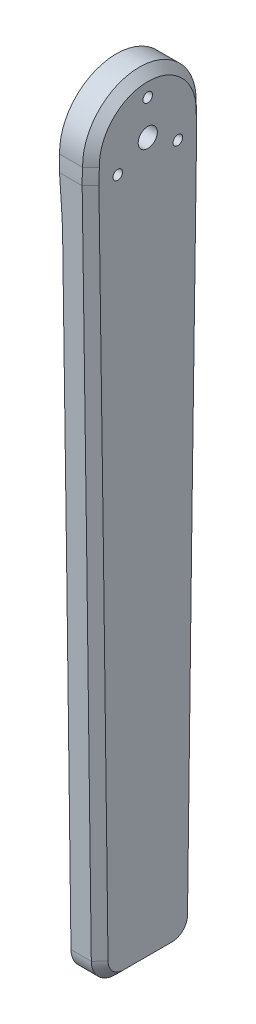
ISO-10303-21;
HEADER;
FILE_DESCRIPTION(('STEP AP214'),'2;1');
FILE_NAME('part.step','',(''),(''),'','','');
FILE_SCHEMA(('AUTOMOTIVE_DESIGN { 1 0 10303 214 1 1 1 1 }'));
ENDSEC;
DATA;
#1=APPLICATION_CONTEXT('core data for automotive mechanical design processes');
#2=APPLICATION_PROTOCOL_DEFINITION('international standard','automotive_design',2000,#1);
#3=PRODUCT_CONTEXT('',#1,'mechanical');
#4=PRODUCT('Part','Part','',(#3));
#5=PRODUCT_RELATED_PRODUCT_CATEGORY('part','',(#4));
#6=PRODUCT_DEFINITION_FORMATION('','',#4);
#7=PRODUCT_DEFINITION_CONTEXT('part definition',#1,'design');
#8=PRODUCT_DEFINITION('design','',#6,#7);
#9=PRODUCT_DEFINITION_SHAPE('','',#8);
#10=(LENGTH_UNIT() NAMED_UNIT(*) SI_UNIT(.MILLI.,.METRE.));
#11=(NAMED_UNIT(*) PLANE_ANGLE_UNIT() SI_UNIT($,.RADIAN.));
#12=(NAMED_UNIT(*) SI_UNIT($,.STERADIAN.) SOLID_ANGLE_UNIT());
#13=UNCERTAINTY_MEASURE_WITH_UNIT(LENGTH_MEASURE(1.E-05),#10,'distance_accuracy_value','');
#14=(GEOMETRIC_REPRESENTATION_CONTEXT(3) GLOBAL_UNCERTAINTY_ASSIGNED_CONTEXT((#13)) GLOBAL_UNIT_ASSIGNED_CONTEXT((#10,
#11,#12)) REPRESENTATION_CONTEXT('',''));
#15=CARTESIAN_POINT('',(0.,0.,0.));
#16=DIRECTION('',(0.,0.,1.));
#17=DIRECTION('',(1.,0.,0.));
#18=AXIS2_PLACEMENT_3D('',#15,#16,#17);
#19=CARTESIAN_POINT('',(35.5000099999999,-249.999999999978,49.9963237684379));
#20=DIRECTION('',(-1.,0.,1.14236595469087E-12));
#21=DIRECTION('',(1.14236595469087E-12,0.,1.));
#22=AXIS2_PLACEMENT_3D('',#19,#20,#21);
#23=CYLINDRICAL_SURFACE('',#22,23.75);
#24=DIRECTION('',(-1.,0.,1.14236595469087E-12));
#25=VECTOR('',#24,1.);
#26=CARTESIAN_POINT('',(35.500010000027,-250.777840414539,73.7335827569874));
#27=LINE('',#26,#25);
#28=CARTESIAN_POINT('',(32.0000100000269,-250.777840414539,73.7335827569914));
#29=VERTEX_POINT('',#28);
#30=CARTESIAN_POINT('',(22.3608290332512,-250.777840414539,73.7335827570024));
#31=VERTEX_POINT('',#30);
#32=EDGE_CURVE('E223',#29,#31,#27,.T.);
#33=ORIENTED_EDGE('',*,*,#32,.F.);
#34=CARTESIAN_POINT('',(32.0000099999998,-249.999999999978,49.9963237684419));
#35=DIRECTION('',(1.,0.,-1.14194368247155E-12));
#36=DIRECTION('',(-1.14194368247155E-12,0.,-1.));
#37=AXIS2_PLACEMENT_3D('',#34,#35,#36);
#38=CIRCLE('',#37,23.75);
#39=CARTESIAN_POINT('',(32.0000099999727,-250.976227673197,26.2663958391363));
#40=VERTEX_POINT('',#39);
#41=EDGE_CURVE('E11',#29,#40,#38,.F.);
#42=ORIENTED_EDGE('',*,*,#41,.T.);
#43=DIRECTION('',(1.,0.,-1.14236496048889E-12));
#44=VECTOR('',#43,1.);
#45=CARTESIAN_POINT('',(23.5000099999728,-250.976227673197,26.266395839146));
#46=LINE('',#45,#44);
#47=CARTESIAN_POINT('',(22.360829033197,-250.976227673197,26.2663958391473));
#48=VERTEX_POINT('',#47);
#49=EDGE_CURVE('E174',#48,#40,#46,.T.);
#50=ORIENTED_EDGE('',*,*,#49,.F.);
#51=CARTESIAN_POINT('',(22.3608290332241,-249.999999999978,49.9963237684529));
#52=DIRECTION('',(1.,0.,-1.14253051464175E-12));
#53=DIRECTION('',(-1.14253051464175E-12,0.,-1.));
#54=AXIS2_PLACEMENT_3D('',#51,#52,#53);
#55=CIRCLE('',#54,23.75);
#56=EDGE_CURVE('E236',#48,#31,#55,.T.);
#57=ORIENTED_EDGE('',*,*,#56,.T.);
#58=EDGE_LOOP('',(#33,#42,#50,#57));
#59=FACE_BOUND('',#58,.T.);
#60=ADVANCED_FACE('F37',(#59),#23,.T.);
#61=CARTESIAN_POINT('',(35.5000099999856,-257.249999999978,37.4389554135642));
#62=DIRECTION('',(-1.,0.,1.14236595469087E-12));
#63=DIRECTION('',(1.14236595469087E-12,0.,1.));
#64=AXIS2_PLACEMENT_3D('',#61,#62,#63);
#65=CYLINDRICAL_SURFACE('',#64,2.00000000000001);
#66=CARTESIAN_POINT('',(35.5000099999856,-257.249999999978,37.4389554135642));
#67=DIRECTION('',(1.,0.,-1.14236496048889E-12));
#68=DIRECTION('',(-1.14236496048889E-12,0.,-1.));
#69=AXIS2_PLACEMENT_3D('',#66,#67,#68);
#70=CIRCLE('',#69,2.00000000000001);
#71=CARTESIAN_POINT('',(35.5000099999833,-257.249999999978,35.4389554135642));
#72=VERTEX_POINT('',#71);
#73=EDGE_CURVE('E229',#72,#72,#70,.F.);
#74=ORIENTED_EDGE('',*,*,#73,.F.);
#75=EDGE_LOOP('',(#74));
#76=FACE_BOUND('',#75,.T.);
#77=CARTESIAN_POINT('',(21.5000099999856,-257.249999999978,37.4389554135802));
#78=DIRECTION('',(1.,0.,-1.14236496048889E-12));
#79=DIRECTION('',(-1.14236496048889E-12,0.,-1.));
#80=AXIS2_PLACEMENT_3D('',#77,#78,#79);
#81=CIRCLE('',#80,2.00000000000001);
#82=CARTESIAN_POINT('',(21.5000099999833,-257.249999999978,35.4389554135802));
#83=VERTEX_POINT('',#82);
#84=EDGE_CURVE('E239',#83,#83,#81,.F.);
#85=ORIENTED_EDGE('',*,*,#84,.T.);
#86=EDGE_LOOP('',(#85));
#87=FACE_BOUND('',#86,.T.);
#88=ADVANCED_FACE('F579',(#76,#87),#65,.F.);
#89=CARTESIAN_POINT('',(35.5000100000143,-257.249999999977,62.5536921233129));
#90=DIRECTION('',(-1.,0.,1.14236595469087E-12));
#91=DIRECTION('',(1.14236595469087E-12,0.,1.));
#92=AXIS2_PLACEMENT_3D('',#89,#90,#91);
#93=CYLINDRICAL_SURFACE('',#92,2.);
#94=CARTESIAN_POINT('',(35.5000100000143,-257.249999999977,62.5536921233129));
#95=DIRECTION('',(1.,0.,-1.14236496048889E-12));
#96=DIRECTION('',(-1.14236496048889E-12,0.,-1.));
#97=AXIS2_PLACEMENT_3D('',#94,#95,#96);
#98=CIRCLE('',#97,2.);
#99=CARTESIAN_POINT('',(35.500010000012,-257.249999999977,60.5536921233129));
#100=VERTEX_POINT('',#99);
#101=EDGE_CURVE('E226',#100,#100,#98,.F.);
#102=ORIENTED_EDGE('',*,*,#101,.F.);
#103=EDGE_LOOP('',(#102));
#104=FACE_BOUND('',#103,.T.);
#105=CARTESIAN_POINT('',(21.5000100000143,-257.249999999977,62.5536921233289));
#106=DIRECTION('',(1.,0.,-1.14236496048889E-12));
#107=DIRECTION('',(-1.14236496048889E-12,0.,-1.));
#108=AXIS2_PLACEMENT_3D('',#105,#106,#107);
#109=CIRCLE('',#108,2.);
#110=CARTESIAN_POINT('',(21.500010000012,-257.249999999977,60.5536921233289));
#111=VERTEX_POINT('',#110);
#112=EDGE_CURVE('E225',#111,#111,#109,.F.);
#113=ORIENTED_EDGE('',*,*,#112,.T.);
#114=EDGE_LOOP('',(#113));
#115=FACE_BOUND('',#114,.T.);
#116=ADVANCED_FACE('F581',(#104,#115),#93,.F.);
#117=CARTESIAN_POINT('',(35.5000099999999,-235.499999999978,49.9963237684379));
#118=DIRECTION('',(-1.,0.,1.14236595469087E-12));
#119=DIRECTION('',(1.14236595469087E-12,0.,1.));
#120=AXIS2_PLACEMENT_3D('',#117,#118,#119);
#121=CYLINDRICAL_SURFACE('',#120,2.);
#122=CARTESIAN_POINT('',(35.5000099999999,-235.499999999978,49.9963237684379));
#123=DIRECTION('',(1.,0.,-1.14236496048889E-12));
#124=DIRECTION('',(-1.14236496048889E-12,0.,-1.));
#125=AXIS2_PLACEMENT_3D('',#122,#123,#124);
#126=CIRCLE('',#125,2.);
#127=CARTESIAN_POINT('',(35.5000099999976,-235.499999999978,47.9963237684379));
#128=VERTEX_POINT('',#127);
#129=EDGE_CURVE('E233',#128,#128,#126,.F.);
#130=ORIENTED_EDGE('',*,*,#129,.F.);
#131=EDGE_LOOP('',(#130));
#132=FACE_BOUND('',#131,.T.);
#133=CARTESIAN_POINT('',(21.5000099999999,-235.499999999978,49.9963237684539));
#134=DIRECTION('',(1.,0.,-1.14236496048889E-12));
#135=DIRECTION('',(-1.14236496048889E-12,0.,-1.));
#136=AXIS2_PLACEMENT_3D('',#133,#134,#135);
#137=CIRCLE('',#136,2.);
#138=CARTESIAN_POINT('',(21.5000099999976,-235.499999999978,47.9963237684539));
#139=VERTEX_POINT('',#138);
#140=EDGE_CURVE('E230',#139,#139,#137,.F.);
#141=ORIENTED_EDGE('',*,*,#140,.T.);
#142=EDGE_LOOP('',(#141));
#143=FACE_BOUND('',#142,.T.);
#144=ADVANCED_FACE('F527',(#132,#143),#121,.F.);
#145=CARTESIAN_POINT('',(35.500010000057,0.,99.9963237684379));
#146=DIRECTION('',(1.,0.,-1.14236496048889E-12));
#147=DIRECTION('',(-1.14236496048889E-12,0.,-1.));
#148=AXIS2_PLACEMENT_3D('',#145,#146,#147);
#149=PLANE('',#148);
#150=CARTESIAN_POINT('',(35.5000099999999,-250.002122473244,49.9999999999737));
#151=DIRECTION('',(1.,0.,-1.14236496048889E-12));
#152=DIRECTION('',(-1.14236496048889E-12,0.,-1.));
#153=AXIS2_PLACEMENT_3D('',#150,#151,#152);
#154=CIRCLE('',#153,3.99999949999999);
#155=CARTESIAN_POINT('',(35.5000099999953,-250.002122473244,46.0000004999737));
#156=VERTEX_POINT('',#155);
#157=EDGE_CURVE('E331',#156,#156,#154,.T.);
#158=ORIENTED_EDGE('',*,*,#157,.F.);
#159=EDGE_LOOP('',(#158));
#160=FACE_BOUND('',#159,.T.);
#161=CARTESIAN_POINT('',(35.5000099999766,-257.456675345093,29.5582832962341));
#162=CARTESIAN_POINT('',(35.5000099999774,-304.559663924441,30.2607868571678));
#163=CARTESIAN_POINT('',(35.5000099999781,-351.663226140184,30.9233765437583));
#164=CARTESIAN_POINT('',(35.5000099999796,-445.871165327914,32.1898428828265));
#165=CARTESIAN_POINT('',(35.5000099999803,-492.975527253482,32.7935155175973));
#166=CARTESIAN_POINT('',(35.5000099999809,-540.080167190638,33.374570031555));
#167=B_SPLINE_CURVE_WITH_KNOTS('',3,(#161,#162,#163,#164,#165,#166),.UNSPECIFIED.,.F.,.F.,(4,2,
4),(0.,0.141324670601602,0.282649341203204),.UNSPECIFIED.);
#168=CARTESIAN_POINT('',(35.5000099999809,-540.080167190638,33.3745700315549));
#169=VERTEX_POINT('',#168);
#170=CARTESIAN_POINT('',(35.5000099999766,-257.456675345093,29.5582832962341));
#171=VERTEX_POINT('',#170);
#172=EDGE_CURVE('E442',#169,#171,#167,.F.);
#173=ORIENTED_EDGE('',*,*,#172,.T.);
#174=CARTESIAN_POINT('',(35.5000100000525,-256.464841301306,96.0508863828149));
#175=DIRECTION('',(1.,0.,-1.14236496048889E-12));
#176=DIRECTION('',(-1.14236496048889E-12,0.,-1.));
#177=AXIS2_PLACEMENT_3D('',#174,#175,#176);
#178=CIRCLE('',#177,66.4999999999999);
#179=CARTESIAN_POINT('',(35.5000099999768,-251.03608213577,29.7728464757494));
#180=VERTEX_POINT('',#179);
#181=EDGE_CURVE('E264',#171,#180,#178,.T.);
#182=ORIENTED_EDGE('',*,*,#181,.T.);
#183=CARTESIAN_POINT('',(35.5000099999999,-249.999999999978,49.9963237684379));
#184=DIRECTION('',(1.,0.,-1.14236496048889E-12));
#185=DIRECTION('',(-1.14236496048889E-12,0.,-1.));
#186=AXIS2_PLACEMENT_3D('',#183,#184,#185);
#187=CIRCLE('',#186,20.2499999999999);
#188=CARTESIAN_POINT('',(35.500010000023,-250.851579650595,70.2284099707713));
#189=VERTEX_POINT('',#188);
#190=EDGE_CURVE('E503',#180,#189,#187,.T.);
#191=ORIENTED_EDGE('',*,*,#190,.T.);
#192=CARTESIAN_POINT('',(35.5000099999473,-256.219564758815,3.94542017793014));
#193=DIRECTION('',(1.,0.,-1.14236496048889E-12));
#194=DIRECTION('',(-1.14236496048889E-12,0.,-1.));
#195=AXIS2_PLACEMENT_3D('',#192,#193,#194);
#196=CIRCLE('',#195,66.4999999999999);
#197=CARTESIAN_POINT('',(35.5000100000233,-257.211597711561,70.4380202971964));
#198=VERTEX_POINT('',#197);
#199=EDGE_CURVE('E433',#189,#198,#196,.T.);
#200=ORIENTED_EDGE('',*,*,#199,.T.);
#201=CARTESIAN_POINT('',(35.5000100000189,-540.080167190637,66.6180775053208));
#202=CARTESIAN_POINT('',(35.5000100000195,-492.934679281678,67.1996360370235));
#203=CARTESIAN_POINT('',(35.5000100000203,-445.789475965788,67.8038511452535));
#204=CARTESIAN_POINT('',(35.5000100000217,-351.499846688616,69.0715190662629));
#205=CARTESIAN_POINT('',(35.5000100000225,-304.355427076611,69.734766950831));
#206=CARTESIAN_POINT('',(35.5000100000233,-257.211597711561,70.4380202971964));
#207=B_SPLINE_CURVE_WITH_KNOTS('',3,(#201,#202,#203,#204,#205,#206),.UNSPECIFIED.,.F.,.F.,(4,2,
4),(0.,0.141447216532023,0.282894433064046),.UNSPECIFIED.);
#208=CARTESIAN_POINT('',(35.5000100000189,-540.080167190637,66.6180775053208));
#209=VERTEX_POINT('',#208);
#210=EDGE_CURVE('E422',#198,#209,#207,.F.);
#211=ORIENTED_EDGE('',*,*,#210,.T.);
#212=CARTESIAN_POINT('',(35.5000100000115,-539.999999999977,60.118571891696));
#213=DIRECTION('',(1.,0.,-1.14236496048889E-12));
#214=DIRECTION('',(-1.14236496048889E-12,0.,-1.));
#215=AXIS2_PLACEMENT_3D('',#212,#213,#214);
#216=CIRCLE('',#215,6.49999999999995);
#217=CARTESIAN_POINT('',(35.5000100000115,-546.499999999977,60.118571891696));
#218=VERTEX_POINT('',#217);
#219=EDGE_CURVE('E432',#209,#218,#216,.T.);
#220=ORIENTED_EDGE('',*,*,#219,.T.);
#221=DIRECTION('',(-1.14236496048889E-12,0.,-1.));
#222=VECTOR('',#221,1.);
#223=CARTESIAN_POINT('',(35.500010000057,-546.499999999978,99.9963237684349));
#224=LINE('',#223,#222);
#225=CARTESIAN_POINT('',(35.5000099999884,-546.499999999977,39.8740756451798));
#226=VERTEX_POINT('',#225);
#227=EDGE_CURVE('E286',#218,#226,#224,.T.);
#228=ORIENTED_EDGE('',*,*,#227,.T.);
#229=CARTESIAN_POINT('',(35.5000099999884,-539.999999999977,39.8740756451798));
#230=DIRECTION('',(1.,0.,-1.14236496048889E-12));
#231=DIRECTION('',(-1.14236496048889E-12,0.,-1.));
#232=AXIS2_PLACEMENT_3D('',#229,#230,#231);
#233=CIRCLE('',#232,6.49999999999994);
#234=EDGE_CURVE('E486',#226,#169,#233,.T.);
#235=ORIENTED_EDGE('',*,*,#234,.T.);
#236=EDGE_LOOP('',(#173,#182,#191,#200,#211,#220,#228,#235));
#237=FACE_BOUND('',#236,.T.);
#238=ORIENTED_EDGE('',*,*,#101,.T.);
#239=EDGE_LOOP('',(#238));
#240=FACE_BOUND('',#239,.T.);
#241=ORIENTED_EDGE('',*,*,#73,.T.);
#242=EDGE_LOOP('',(#241));
#243=FACE_BOUND('',#242,.T.);
#244=ORIENTED_EDGE('',*,*,#129,.T.);
#245=EDGE_LOOP('',(#244));
#246=FACE_BOUND('',#245,.T.);
#247=ADVANCED_FACE('F506',(#160,#237,#240,#243,#246),#149,.T.);
#248=CARTESIAN_POINT('',(21.500010000057,0.,99.9963237684539));
#249=DIRECTION('',(1.,0.,-1.14236496048889E-12));
#250=DIRECTION('',(-1.14236496048889E-12,0.,-1.));
#251=AXIS2_PLACEMENT_3D('',#248,#249,#250);
#252=PLANE('',#251);
#253=CARTESIAN_POINT('',(21.5000099999999,-250.002122473244,49.9999999999897));
#254=DIRECTION('',(1.,0.,-1.14236496048889E-12));
#255=DIRECTION('',(-1.14236496048889E-12,0.,-1.));
#256=AXIS2_PLACEMENT_3D('',#253,#254,#255);
#257=CIRCLE('',#256,3.99999949999999);
#258=CARTESIAN_POINT('',(21.5000099999953,-250.002122473244,46.0000004999897));
#259=VERTEX_POINT('',#258);
#260=EDGE_CURVE('E43',#259,#259,#257,.T.);
#261=ORIENTED_EDGE('',*,*,#260,.T.);
#262=EDGE_LOOP('',(#261));
#263=FACE_BOUND('',#262,.T.);
#264=CARTESIAN_POINT('',(21.5000099999999,-249.999999999978,49.9963237684539));
#265=DIRECTION('',(1.,0.,-1.14236496048889E-12));
#266=DIRECTION('',(-1.14236496048889E-12,0.,-1.));
#267=AXIS2_PLACEMENT_3D('',#264,#265,#266);
#268=CIRCLE('',#267,21.25);
#269=CARTESIAN_POINT('',(21.5000099999756,-249.999999999978,28.7463237684539));
#270=VERTEX_POINT('',#269);
#271=EDGE_CURVE('E247',#270,#270,#268,.F.);
#272=ORIENTED_EDGE('',*,*,#271,.T.);
#273=EDGE_LOOP('',(#272));
#274=FACE_BOUND('',#273,.T.);
#275=ORIENTED_EDGE('',*,*,#112,.F.);
#276=EDGE_LOOP('',(#275));
#277=FACE_BOUND('',#276,.T.);
#278=ORIENTED_EDGE('',*,*,#84,.F.);
#279=EDGE_LOOP('',(#278));
#280=FACE_BOUND('',#279,.T.);
#281=ORIENTED_EDGE('',*,*,#140,.F.);
#282=EDGE_LOOP('',(#281));
#283=FACE_BOUND('',#282,.T.);
#284=ADVANCED_FACE('F526',(#263,#274,#277,#280,#283),#252,.F.);
#285=CARTESIAN_POINT('',(22.3608290332241,-249.999999999978,49.9963237684529));
#286=DIRECTION('',(1.,0.,-1.14253051464175E-12));
#287=DIRECTION('',(-1.14253051464175E-12,0.,-1.));
#288=AXIS2_PLACEMENT_3D('',#285,#286,#287);
#289=CONICAL_SURFACE('',#288,23.75,1.23918376891598);
#290=ORIENTED_EDGE('',*,*,#271,.F.);
#291=EDGE_LOOP('',(#290));
#292=FACE_BOUND('',#291,.T.);
#293=EDGE_CURVE('E244',#31,#48,#55,.T.);
#294=ORIENTED_EDGE('',*,*,#293,.F.);
#295=ORIENTED_EDGE('',*,*,#56,.F.);
#296=EDGE_LOOP('',(#294,#295));
#297=FACE_BOUND('',#296,.T.);
#298=ADVANCED_FACE('F571',(#292,#297),#289,.T.);
#299=CARTESIAN_POINT('',(23.500010000057,0.,99.9963237684516));
#300=DIRECTION('',(1.,0.,-1.142367067998E-12));
#301=DIRECTION('',(-1.142367067998E-12,0.,-1.));
#302=AXIS2_PLACEMENT_3D('',#299,#300,#301);
#303=PLANE('',#302);
#304=CARTESIAN_POINT('',(23.5000100000274,-250.721337698999,74.0355037029663));
#305=CARTESIAN_POINT('',(23.5000100000266,-294.251253317778,73.3825549686846));
#306=CARTESIAN_POINT('',(23.5000100000251,-386.014835010526,72.0766575001162));
#307=CARTESIAN_POINT('',(23.5000100000236,-487.185917611135,70.7707600315679));
#308=CARTESIAN_POINT('',(23.5000100000229,-540.123334139454,70.1178112972865));
#309=B_SPLINE_CURVE_WITH_KNOTS('',3,(#304,#305,#306,#307,#308),.UNSPECIFIED.,.F.,.F.,(4,1,4),
(0.00267162110748558,0.486337350205034,0.970003079302583),.UNSPECIFIED.);
#310=CARTESIAN_POINT('',(23.5000100000269,-280.803947379207,73.5897451252675));
#311=VERTEX_POINT('',#310);
#312=CARTESIAN_POINT('',(23.5000100000229,-540.123334139454,70.1178112972865));
#313=VERTEX_POINT('',#312);
#314=EDGE_CURVE('E134',#311,#313,#309,.T.);
#315=ORIENTED_EDGE('',*,*,#314,.F.);
#316=CARTESIAN_POINT('',(23.5000099999999,-249.999999999978,49.9963237684516));
#317=DIRECTION('',(1.,0.,-1.142367067998E-12));
#318=DIRECTION('',(-1.142367067998E-12,0.,-1.));
#319=AXIS2_PLACEMENT_3D('',#316,#317,#318);
#320=CIRCLE('',#319,38.8011946396322);
#321=CARTESIAN_POINT('',(23.500009999973,-280.803947379208,26.4029024116357));
#322=VERTEX_POINT('',#321);
#323=EDGE_CURVE('E614',#311,#322,#320,.T.);
#324=ORIENTED_EDGE('',*,*,#323,.T.);
#325=CARTESIAN_POINT('',(23.5000099999724,-250.721337698999,25.957143833937));
#326=CARTESIAN_POINT('',(23.5000099999732,-294.251253317778,26.6100925682187));
#327=CARTESIAN_POINT('',(23.5000099999747,-386.014835010527,27.9159900367871));
#328=CARTESIAN_POINT('',(23.5000099999762,-487.185917611135,29.2218875053353));
#329=CARTESIAN_POINT('',(23.5000099999769,-540.123334139454,29.8748362396167));
#330=B_SPLINE_CURVE_WITH_KNOTS('',3,(#325,#326,#327,#328,#329),.UNSPECIFIED.,.F.,.F.,(4,1,4),
(0.00267162110748538,0.486337350205034,0.970003079302583),.UNSPECIFIED.);
#331=CARTESIAN_POINT('',(23.5000099999769,-540.123334139454,29.8748362396167));
#332=VERTEX_POINT('',#331);
#333=EDGE_CURVE('E155',#322,#332,#330,.T.);
#334=ORIENTED_EDGE('',*,*,#333,.T.);
#335=CARTESIAN_POINT('',(23.5000099999883,-539.999999999977,39.8740756451935));
#336=DIRECTION('',(1.,0.,-1.142367067998E-12));
#337=DIRECTION('',(-1.142367067998E-12,0.,-1.));
#338=AXIS2_PLACEMENT_3D('',#335,#336,#337);
#339=CIRCLE('',#338,10.);
#340=CARTESIAN_POINT('',(23.5000099999883,-549.999999999977,39.8740756451935));
#341=VERTEX_POINT('',#340);
#342=EDGE_CURVE('E162',#332,#341,#339,.F.);
#343=ORIENTED_EDGE('',*,*,#342,.T.);
#344=DIRECTION('',(-1.142367067998E-12,0.,-1.));
#345=VECTOR('',#344,1.);
#346=CARTESIAN_POINT('',(23.500010000057,-549.999999999978,99.9963237684486));
#347=LINE('',#346,#345);
#348=CARTESIAN_POINT('',(23.5000100000115,-549.999999999977,60.1185718917097));
#349=VERTEX_POINT('',#348);
#350=EDGE_CURVE('E160',#349,#341,#347,.T.);
#351=ORIENTED_EDGE('',*,*,#350,.F.);
#352=CARTESIAN_POINT('',(23.5000100000115,-539.999999999977,60.1185718917097));
#353=DIRECTION('',(1.,0.,-1.142367067998E-12));
#354=DIRECTION('',(-1.142367067998E-12,0.,-1.));
#355=AXIS2_PLACEMENT_3D('',#352,#353,#354);
#356=CIRCLE('',#355,10.);
#357=EDGE_CURVE('E145',#313,#349,#356,.T.);
#358=ORIENTED_EDGE('',*,*,#357,.F.);
#359=EDGE_LOOP('',(#315,#324,#334,#343,#351,#358));
#360=FACE_BOUND('',#359,.T.);
#361=ADVANCED_FACE('F158',(#360),#303,.F.);
#362=DIRECTION('',(1.,0.,-1.14236496048889E-12));
#363=VECTOR('',#362,1.);
#364=SURFACE_OF_LINEAR_EXTRUSION('',#330,#363);
#365=DIRECTION('',(1.,0.,-1.14236496048889E-12));
#366=VECTOR('',#365,1.);
#367=CARTESIAN_POINT('',(23.5000099999726,-257.508877136868,26.0586726074803));
#368=LINE('',#367,#366);
#369=CARTESIAN_POINT('',(22.5552520989431,-257.508877136868,26.0586726074814));
#370=VERTEX_POINT('',#369);
#371=CARTESIAN_POINT('',(32.0000099999724,-257.508877136868,26.0586726074706));
#372=VERTEX_POINT('',#371);
#373=EDGE_CURVE('E250',#370,#372,#368,.T.);
#374=ORIENTED_EDGE('',*,*,#373,.T.);
#375=CARTESIAN_POINT('',(32.0000099999724,-257.508877136871,26.0586726074706));
#376=CARTESIAN_POINT('',(32.0000099999731,-299.013761079378,26.6777784172381));
#377=CARTESIAN_POINT('',(32.0000099999746,-388.636729450114,27.9498329612914));
#378=CARTESIAN_POINT('',(32.0000099999761,-487.185917611135,29.2218875053256));
#379=CARTESIAN_POINT('',(32.0000099999768,-540.123334139454,29.874836239607));
#380=B_SPLINE_CURVE_WITH_KNOTS('',3,(#375,#376,#377,#378,#379),.UNSPECIFIED.,.F.,.F.,(4,1,4),
(0.0277404540811472,0.486337350205034,0.970003079302583),.UNSPECIFIED.);
#381=CARTESIAN_POINT('',(32.0000099999768,-540.123334139454,29.874836239607));
#382=VERTEX_POINT('',#381);
#383=EDGE_CURVE('E213',#372,#382,#380,.T.);
#384=ORIENTED_EDGE('',*,*,#383,.T.);
#385=DIRECTION('',(1.,0.,-1.14236496048889E-12));
#386=VECTOR('',#385,1.);
#387=CARTESIAN_POINT('',(23.5000099999769,-540.123334139454,29.8748362396167));
#388=LINE('',#387,#386);
#389=EDGE_CURVE('E266',#332,#382,#388,.T.);
#390=ORIENTED_EDGE('',*,*,#389,.F.);
#391=ORIENTED_EDGE('',*,*,#333,.F.);
#392=CARTESIAN_POINT('',(23.500009999973,-280.803947379208,26.4029024116358));
#393=CARTESIAN_POINT('',(23.5000146068611,-280.318274216933,26.3957921546852));
#394=CARTESIAN_POINT('',(23.497829985572,-279.832603634498,26.3886778519312));
#395=CARTESIAN_POINT('',(23.4893555041966,-278.861351962935,26.3744423649585));
#396=CARTESIAN_POINT('',(23.4830661001013,-278.375770869859,26.3673211815918));
#397=CARTESIAN_POINT('',(23.4666556044085,-277.404701471527,26.3530719580401));
#398=CARTESIAN_POINT('',(23.4565347248002,-276.919213162624,26.3459439182562));
#399=CARTESIAN_POINT('',(23.4327687580072,-275.948330304371,26.3316809728742));
#400=CARTESIAN_POINT('',(23.4191237193647,-275.462935753821,26.324546067372));
#401=CARTESIAN_POINT('',(23.3886464218412,-274.492299021404,26.3102702289325));
#402=CARTESIAN_POINT('',(23.3718145003385,-274.007056828849,26.3031292967128));
#403=CARTESIAN_POINT('',(23.3353298525538,-273.036669014175,26.2888405623758));
#404=CARTESIAN_POINT('',(23.3156770663374,-272.551523394327,26.2816927601159));
#405=CARTESIAN_POINT('',(23.2739517912725,-271.581328134961,26.2673902530192));
#406=CARTESIAN_POINT('',(23.251879258207,-271.096278497359,26.2602355480587));
#407=CARTESIAN_POINT('',(23.205750751081,-270.126273066142,26.245919179753));
#408=CARTESIAN_POINT('',(23.1816947721216,-269.641317272762,26.2387575163907));
#409=CARTESIAN_POINT('',(23.1320506612449,-268.671094649628,26.224421223996));
#410=CARTESIAN_POINT('',(23.1064613156202,-268.185827882472,26.2172465891711));
#411=CARTESIAN_POINT('',(23.0542750115556,-267.215354890202,26.2028898048661));
#412=CARTESIAN_POINT('',(23.0276780652963,-266.730148664427,26.1957076554778));
#413=CARTESIAN_POINT('',(22.9740153662575,-265.759766131389,26.1813353615234));
#414=CARTESIAN_POINT('',(22.94694961704,-265.274589823926,26.1741452170184));
#415=CARTESIAN_POINT('',(22.8929158845498,-264.304234944463,26.1597564268218));
#416=CARTESIAN_POINT('',(22.8659479006586,-263.819056372497,26.1525577811843));
#417=CARTESIAN_POINT('',(22.8126939939814,-262.848603778372,26.1381505746276));
#418=CARTESIAN_POINT('',(22.7864081526537,-262.363329751721,26.1309420126313));
#419=CARTESIAN_POINT('',(22.7351198402905,-261.392712270121,26.116515324362));
#420=CARTESIAN_POINT('',(22.7101173727469,-260.907368814986,26.109297198063));
#421=CARTESIAN_POINT('',(22.661993954315,-259.936578217313,26.0948508368932));
#422=CARTESIAN_POINT('',(22.6388730398894,-259.451131072948,26.0876226018294));
#423=CARTESIAN_POINT('',(22.5950817712391,-258.48010259999,26.0731555321077));
#424=CARTESIAN_POINT('',(22.574411539486,-257.994521265904,26.0659166969383));
#425=CARTESIAN_POINT('',(22.5552520989431,-257.508877136868,26.0586726074814));
#426=B_SPLINE_CURVE_WITH_KNOTS('',3,(#392,#393,#394,#395,#396,#397,#398,#399,#400,#401,#402,
#403,#404,#405,#406,#407,#408,#409,#410,#411,#412,#413,#414,#415,#416,#417,#418,#419,#420,#421,
#422,#423,#424,#425),.UNSPECIFIED.,.F.,.F.,(4,2,2,2,2,2,2,2,2,2,2,2,2,2,2,2,4),(0.,
1.45716699261733,2.91417213945658,4.37109668438985,5.82800116253613,7.28475149215012,
8.74153277774727,10.1983406881736,11.6551521968056,13.1131324521249,14.5710950877853,
16.0290466507372,17.4869889749513,18.9451046063485,20.4032242047742,21.8613720534846,
23.3195927417134),.UNSPECIFIED.);
#427=EDGE_CURVE('E191',#322,#370,#426,.T.);
#428=ORIENTED_EDGE('',*,*,#427,.T.);
#429=EDGE_LOOP('',(#374,#384,#390,#391,#428));
#430=FACE_BOUND('',#429,.T.);
#431=ADVANCED_FACE('F180',(#430),#364,.F.);
#432=CARTESIAN_POINT('',(23.5000099999883,-539.999999999977,39.8740756451935));
#433=DIRECTION('',(1.,0.,-1.14236496048889E-12));
#434=DIRECTION('',(-1.14236496048889E-12,0.,-1.));
#435=AXIS2_PLACEMENT_3D('',#432,#433,#434);
#436=CYLINDRICAL_SURFACE('',#435,10.);
#437=ORIENTED_EDGE('',*,*,#389,.T.);
#438=CARTESIAN_POINT('',(32.0000099999882,-539.999999999977,39.8740756451838));
#439=DIRECTION('',(1.,0.,-1.14392622358695E-12));
#440=DIRECTION('',(-1.14392622358695E-12,0.,-1.));
#441=AXIS2_PLACEMENT_3D('',#438,#439,#440);
#442=CIRCLE('',#441,10.);
#443=CARTESIAN_POINT('',(32.0000099999882,-549.999999999977,39.8740756451838));
#444=VERTEX_POINT('',#443);
#445=EDGE_CURVE('E205',#382,#444,#442,.F.);
#446=ORIENTED_EDGE('',*,*,#445,.T.);
#447=DIRECTION('',(1.,0.,-1.14236496048889E-12));
#448=VECTOR('',#447,1.);
#449=CARTESIAN_POINT('',(23.5000099999883,-549.999999999977,39.8740756451935));
#450=LINE('',#449,#448);
#451=EDGE_CURVE('E268',#341,#444,#450,.T.);
#452=ORIENTED_EDGE('',*,*,#451,.F.);
#453=ORIENTED_EDGE('',*,*,#342,.F.);
#454=EDGE_LOOP('',(#437,#446,#452,#453));
#455=FACE_BOUND('',#454,.T.);
#456=ADVANCED_FACE('F185',(#455),#436,.T.);
#457=CARTESIAN_POINT('',(23.500010000057,-549.999999999978,99.9963237684486));
#458=DIRECTION('',(0.,-1.,0.));
#459=DIRECTION('',(1.14253051464175E-12,0.,1.));
#460=AXIS2_PLACEMENT_3D('',#457,#458,#459);
#461=PLANE('',#460);
#462=ORIENTED_EDGE('',*,*,#451,.T.);
#463=DIRECTION('',(1.14236496048889E-12,0.,1.));
#464=VECTOR('',#463,1.);
#465=CARTESIAN_POINT('',(32.0000100000569,-549.999999999978,99.9963237684389));
#466=LINE('',#465,#464);
#467=CARTESIAN_POINT('',(32.0000100000114,-549.999999999977,60.1185718917));
#468=VERTEX_POINT('',#467);
#469=EDGE_CURVE('E212',#444,#468,#466,.T.);
#470=ORIENTED_EDGE('',*,*,#469,.T.);
#471=DIRECTION('',(1.,0.,-1.14236496048889E-12));
#472=VECTOR('',#471,1.);
#473=CARTESIAN_POINT('',(23.5000100000115,-549.999999999977,60.1185718917097));
#474=LINE('',#473,#472);
#475=EDGE_CURVE('E154',#349,#468,#474,.T.);
#476=ORIENTED_EDGE('',*,*,#475,.F.);
#477=ORIENTED_EDGE('',*,*,#350,.T.);
#478=EDGE_LOOP('',(#462,#470,#476,#477));
#479=FACE_BOUND('',#478,.T.);
#480=ADVANCED_FACE('F701',(#479),#461,.T.);
#481=CARTESIAN_POINT('',(23.5000100000115,-539.999999999977,60.1185718917097));
#482=DIRECTION('',(1.,0.,-1.14236496048889E-12));
#483=DIRECTION('',(-1.14236496048889E-12,0.,-1.));
#484=AXIS2_PLACEMENT_3D('',#481,#482,#483);
#485=CYLINDRICAL_SURFACE('',#484,10.);
#486=ORIENTED_EDGE('',*,*,#475,.T.);
#487=CARTESIAN_POINT('',(32.0000100000114,-539.999999999977,60.1185718917));
#488=DIRECTION('',(1.,0.,-1.14392622358695E-12));
#489=DIRECTION('',(-1.14392622358695E-12,0.,-1.));
#490=AXIS2_PLACEMENT_3D('',#487,#488,#489);
#491=CIRCLE('',#490,10.);
#492=CARTESIAN_POINT('',(32.0000100000228,-540.123334139454,70.1178112972768));
#493=VERTEX_POINT('',#492);
#494=EDGE_CURVE('E153',#468,#493,#491,.F.);
#495=ORIENTED_EDGE('',*,*,#494,.T.);
#496=DIRECTION('',(1.,0.,-1.14236496048889E-12));
#497=VECTOR('',#496,1.);
#498=CARTESIAN_POINT('',(23.5000100000229,-540.123334139454,70.1178112972865));
#499=LINE('',#498,#497);
#500=EDGE_CURVE('E137',#313,#493,#499,.T.);
#501=ORIENTED_EDGE('',*,*,#500,.F.);
#502=ORIENTED_EDGE('',*,*,#357,.T.);
#503=EDGE_LOOP('',(#486,#495,#501,#502));
#504=FACE_BOUND('',#503,.T.);
#505=ADVANCED_FACE('F151',(#504),#485,.T.);
#506=DIRECTION('',(1.,0.,-1.14236496048889E-12));
#507=VECTOR('',#506,1.);
#508=SURFACE_OF_LINEAR_EXTRUSION('',#309,#507);
#509=ORIENTED_EDGE('',*,*,#500,.T.);
#510=CARTESIAN_POINT('',(32.0000100000228,-540.123334139454,70.1178112972768));
#511=CARTESIAN_POINT('',(32.0000100000235,-487.185917611135,70.7707600315581));
#512=CARTESIAN_POINT('',(32.000010000025,-388.542318924464,72.0440332090525));
#513=CARTESIAN_POINT('',(32.0000100000264,-298.842050930507,73.3173063865659));
#514=CARTESIAN_POINT('',(32.0000100000271,-257.263809972232,73.9376308297935));
#515=B_SPLINE_CURVE_WITH_KNOTS('',3,(#510,#511,#512,#513,#514),.UNSPECIFIED.,.F.,.F.,(4,1,4),
(0.0268377626292275,0.510503491726776,0.970003079302583),.UNSPECIFIED.);
#516=CARTESIAN_POINT('',(32.0000100000271,-257.263809972229,73.9376308297935));
#517=VERTEX_POINT('',#516);
#518=EDGE_CURVE('E63',#493,#517,#515,.T.);
#519=ORIENTED_EDGE('',*,*,#518,.T.);
#520=DIRECTION('',(1.,0.,-1.14236496048889E-12));
#521=VECTOR('',#520,1.);
#522=CARTESIAN_POINT('',(35.5000100000273,-257.263809972229,73.9376308297895));
#523=LINE('',#522,#521);
#524=CARTESIAN_POINT('',(22.5457086789724,-257.263809972229,73.9376308298043));
#525=VERTEX_POINT('',#524);
#526=EDGE_CURVE('E258',#517,#525,#523,.F.);
#527=ORIENTED_EDGE('',*,*,#526,.T.);
#528=CARTESIAN_POINT('',(22.5457086789724,-257.263809972229,73.9376308298043));
#529=CARTESIAN_POINT('',(22.575821496071,-258.048706798967,73.9259206036975));
#530=CARTESIAN_POINT('',(22.6100338270544,-258.833425426306,73.9142243181954));
#531=CARTESIAN_POINT('',(22.6841862146614,-260.402531835131,73.8908590989895));
#532=CARTESIAN_POINT('',(22.7241258080166,-261.186919638235,73.8791901631509));
#533=CARTESIAN_POINT('',(22.8072653209262,-262.755483543044,73.855877715672));
#534=CARTESIAN_POINT('',(22.8504651020386,-263.53965965232,73.8442342029737));
#535=CARTESIAN_POINT('',(22.9375949925887,-265.107937345693,73.8209704260884));
#536=CARTESIAN_POINT('',(22.9815250702431,-265.892038931548,73.8093501609141));
#537=CARTESIAN_POINT('',(23.0677229697258,-267.460293354566,73.7861308885062));
#538=CARTESIAN_POINT('',(23.1099908799984,-268.244446186774,73.7745318801729));
#539=CARTESIAN_POINT('',(23.1906785809495,-269.813091280983,73.7513507458088));
#540=CARTESIAN_POINT('',(23.2290976961371,-270.597583578384,73.7397686230919));
#541=CARTESIAN_POINT('',(23.300114971683,-272.166785753823,73.7166229643036));
#542=CARTESIAN_POINT('',(23.3327135080663,-272.951495614524,73.7050594270793));
#543=CARTESIAN_POINT('',(23.3903736297223,-274.521183727853,73.681950087341));
#544=CARTESIAN_POINT('',(23.4154353431057,-275.306161975692,73.670404284529));
#545=CARTESIAN_POINT('',(23.4565211239036,-276.876433771938,73.6473296250935));
#546=CARTESIAN_POINT('',(23.472544371629,-277.66172734248,73.6358007701016));
#547=CARTESIAN_POINT('',(23.4943066941483,-279.232657046374,73.6127595069699));
#548=CARTESIAN_POINT('',(23.5000431163571,-280.018293215845,73.6012471038369));
#549=CARTESIAN_POINT('',(23.5000100000269,-280.803947379208,73.5897451252675));
#550=B_SPLINE_CURVE_WITH_KNOTS('',3,(#528,#529,#530,#531,#532,#533,#534,#535,#536,#537,#538,
#539,#540,#541,#542,#543,#544,#545,#546,#547,#548,#549),.UNSPECIFIED.,.F.,.F.,(4,2,2,2,2,2,2,2,
2,2,4),(0.,2.35664448090205,4.71309844433693,7.06945239860893,9.42570406892702,11.7818301924905,
14.1383691111165,16.4947557358211,18.8511023044479,21.2076625333752,23.5648303431362),.UNSPECIFIED.);
#551=EDGE_CURVE('E140',#525,#311,#550,.T.);
#552=ORIENTED_EDGE('',*,*,#551,.T.);
#553=ORIENTED_EDGE('',*,*,#314,.T.);
#554=EDGE_LOOP('',(#509,#519,#527,#552,#553));
#555=FACE_BOUND('',#554,.T.);
#556=ADVANCED_FACE('F136',(#555),#508,.T.);
#557=CARTESIAN_POINT('',(29.5000100000525,-256.464841301306,96.0508863828218));
#558=DIRECTION('',(1.,0.,-1.14236496048889E-12));
#559=DIRECTION('',(-1.14236496048889E-12,0.,-1.));
#560=AXIS2_PLACEMENT_3D('',#557,#558,#559);
#561=CYLINDRICAL_SURFACE('',#560,70.);
#562=ORIENTED_EDGE('',*,*,#49,.T.);
#563=CARTESIAN_POINT('',(32.0000100000524,-256.464841301306,96.0508863828189));
#564=DIRECTION('',(1.,0.,-1.14194368247155E-12));
#565=DIRECTION('',(-1.14194368247155E-12,0.,-1.));
#566=AXIS2_PLACEMENT_3D('',#563,#564,#565);
#567=CIRCLE('',#566,70.);
#568=EDGE_CURVE('E261',#40,#372,#567,.F.);
#569=ORIENTED_EDGE('',*,*,#568,.T.);
#570=ORIENTED_EDGE('',*,*,#373,.F.);
#571=CARTESIAN_POINT('',(22.5552520989431,-257.508877136868,26.0586726074814));
#572=CARTESIAN_POINT('',(22.5337458378456,-256.964097765238,26.0505453273193));
#573=CARTESIAN_POINT('',(22.5132906855332,-256.419179940445,26.0487799943676));
#574=CARTESIAN_POINT('',(22.4749152053562,-255.329675449248,26.0579726911643));
#575=CARTESIAN_POINT('',(22.4569934313092,-254.785088772055,26.0689234287564));
#576=CARTESIAN_POINT('',(22.4240915405365,-253.696224328585,26.1035385804578));
#577=CARTESIAN_POINT('',(22.409111451502,-253.151946565264,26.1272031142389));
#578=CARTESIAN_POINT('',(22.3824250939836,-252.063700011983,26.1872538879626));
#579=CARTESIAN_POINT('',(22.3707207079056,-251.519731578217,26.2236474157999));
#580=CARTESIAN_POINT('',(22.360829033197,-250.976227673197,26.2663958391473));
#581=B_SPLINE_CURVE_WITH_KNOTS('',3,(#571,#572,#573,#574,#575,#576,#577,#578,#579,#580),
.UNSPECIFIED.,.F.,.F.,(4,2,2,2,4),(0.,1.63575775003795,3.2705779217021,4.90541348179817,
6.5411865916962),.UNSPECIFIED.);
#582=EDGE_CURVE('E497',#370,#48,#581,.T.);
#583=ORIENTED_EDGE('',*,*,#582,.T.);
#584=EDGE_LOOP('',(#562,#569,#570,#583));
#585=FACE_BOUND('',#584,.T.);
#586=ADVANCED_FACE('F496',(#585),#561,.T.);
#587=CARTESIAN_POINT('',(29.5000099999473,-256.219564758815,3.94542017793699));
#588=DIRECTION('',(1.,0.,-1.14236496048889E-12));
#589=DIRECTION('',(-1.14236496048889E-12,0.,-1.));
#590=AXIS2_PLACEMENT_3D('',#587,#588,#589);
#591=CYLINDRICAL_SURFACE('',#590,70.);
#592=ORIENTED_EDGE('',*,*,#526,.F.);
#593=CARTESIAN_POINT('',(32.0000099999472,-256.219564758815,3.94542017793413));
#594=DIRECTION('',(1.,0.,-1.14219150011097E-12));
#595=DIRECTION('',(-1.14219150011097E-12,0.,-1.));
#596=AXIS2_PLACEMENT_3D('',#593,#594,#595);
#597=CIRCLE('',#596,70.);
#598=EDGE_CURVE('E48',#517,#29,#597,.F.);
#599=ORIENTED_EDGE('',*,*,#598,.T.);
#600=ORIENTED_EDGE('',*,*,#32,.T.);
#601=CARTESIAN_POINT('',(22.3608290332512,-250.777840414539,73.7335827570024));
#602=CARTESIAN_POINT('',(22.3699103131185,-251.317471911889,73.7756617946702));
#603=CARTESIAN_POINT('',(22.380793070804,-251.857559386387,73.811476696215));
#604=CARTESIAN_POINT('',(22.4058369310637,-252.938037991965,73.8705522825068));
#605=CARTESIAN_POINT('',(22.4199961736943,-253.478428777902,73.8938200649427));
#606=CARTESIAN_POINT('',(22.4512792563916,-254.559512658322,73.9278229881093));
#607=CARTESIAN_POINT('',(22.4684030695966,-255.100205750023,73.938558242389));
#608=CARTESIAN_POINT('',(22.5052254731741,-256.181914945262,73.9475010701586));
#609=CARTESIAN_POINT('',(22.5249255169721,-256.722931058231,73.9457015417526));
#610=CARTESIAN_POINT('',(22.5457086789724,-257.263809972229,73.9376308298043));
#611=B_SPLINE_CURVE_WITH_KNOTS('',3,(#601,#602,#603,#604,#605,#606,#607,#608,#609,#610),
.UNSPECIFIED.,.F.,.F.,(4,2,2,2,4),(0.,1.62399492150296,3.24707021081339,4.87013079439218,
6.49411103847609),.UNSPECIFIED.);
#612=EDGE_CURVE('E553',#31,#525,#611,.T.);
#613=ORIENTED_EDGE('',*,*,#612,.T.);
#614=EDGE_LOOP('',(#592,#599,#600,#613));
#615=FACE_BOUND('',#614,.T.);
#616=ADVANCED_FACE('F564',(#615),#591,.T.);
#617=CARTESIAN_POINT('',(-76.4999900000001,-249.999999999978,49.9963237685658));
#618=DIRECTION('',(1.,0.,-1.142367067998E-12));
#619=DIRECTION('',(-1.142367067998E-12,0.,-1.));
#620=AXIS2_PLACEMENT_3D('',#617,#618,#619);
#621=DEGENERATE_TOROIDAL_SURFACE('',#620,38.8011946396322,100.,.T.);
#622=ORIENTED_EDGE('',*,*,#612,.F.);
#623=ORIENTED_EDGE('',*,*,#293,.T.);
#624=ORIENTED_EDGE('',*,*,#582,.F.);
#625=ORIENTED_EDGE('',*,*,#427,.F.);
#626=ORIENTED_EDGE('',*,*,#323,.F.);
#627=ORIENTED_EDGE('',*,*,#551,.F.);
#628=EDGE_LOOP('',(#622,#623,#624,#625,#626,#627));
#629=FACE_BOUND('',#628,.T.);
#630=ADVANCED_FACE('F319',(#629),#621,.F.);
#631=CARTESIAN_POINT('',(35.5000100000115,-539.999999999977,60.118571891696));
#632=DIRECTION('',(-1.,0.,1.14392622358695E-12));
#633=DIRECTION('',(1.14392622358695E-12,0.,1.));
#634=AXIS2_PLACEMENT_3D('',#631,#632,#633);
#635=CONICAL_SURFACE('',#634,6.4999999999999,0.785398163397446);
#636=CARTESIAN_POINT('',(32.0000100000228,-540.123334139454,70.1178112972768));
#637=CARTESIAN_POINT('',(35.5000100000189,-540.080167190637,66.6180775053208));
#638=B_SPLINE_CURVE_WITH_KNOTS('',1,(#636,#637),.UNSPECIFIED.,.F.,.F.,(2,2),(0.,1.),.UNSPECIFIED.);
#639=EDGE_CURVE('E280',#493,#209,#638,.T.);
#640=ORIENTED_EDGE('',*,*,#639,.F.);
#641=ORIENTED_EDGE('',*,*,#494,.F.);
#642=DIRECTION('',(-0.707106781186554,-0.707106781186541,8.03270516808732E-13));
#643=VECTOR('',#642,1.);
#644=CARTESIAN_POINT('',(35.5000100000115,-546.499999999977,60.118571891696));
#645=LINE('',#644,#643);
#646=EDGE_CURVE('E146',#218,#468,#645,.T.);
#647=ORIENTED_EDGE('',*,*,#646,.F.);
#648=ORIENTED_EDGE('',*,*,#219,.F.);
#649=EDGE_LOOP('',(#640,#641,#647,#648));
#650=FACE_BOUND('',#649,.T.);
#651=ADVANCED_FACE('F40',(#650),#635,.T.);
#652=CARTESIAN_POINT('',(35.500010000057,-546.499999999978,99.9963237684349));
#653=DIRECTION('',(-0.70710678118654,0.707106781186555,8.11651835609836E-13));
#654=DIRECTION('',(-1.14236496048889E-12,0.,-1.));
#655=AXIS2_PLACEMENT_3D('',#652,#653,#654);
#656=PLANE('',#655);
#657=ORIENTED_EDGE('',*,*,#646,.T.);
#658=ORIENTED_EDGE('',*,*,#469,.F.);
#659=DIRECTION('',(-0.707106781186555,-0.70710678118654,8.07476121608777E-13));
#660=VECTOR('',#659,1.);
#661=CARTESIAN_POINT('',(35.5000099999884,-546.499999999977,39.8740756451798));
#662=LINE('',#661,#660);
#663=EDGE_CURVE('E288',#226,#444,#662,.T.);
#664=ORIENTED_EDGE('',*,*,#663,.F.);
#665=ORIENTED_EDGE('',*,*,#227,.F.);
#666=EDGE_LOOP('',(#657,#658,#664,#665));
#667=FACE_BOUND('',#666,.T.);
#668=ADVANCED_FACE('F283',(#667),#656,.F.);
#669=CARTESIAN_POINT('',(35.5000100000233,-257.211597711561,70.4380202971964));
#670=CARTESIAN_POINT('',(35.5000100000225,-304.355427076611,69.734766950831));
#671=CARTESIAN_POINT('',(35.5000100000217,-351.499846688616,69.0715190662629));
#672=CARTESIAN_POINT('',(35.5000100000203,-445.789475965788,67.8038511452535));
#673=CARTESIAN_POINT('',(35.5000100000195,-492.934679281678,67.1996360370235));
#674=CARTESIAN_POINT('',(35.5000100000189,-540.080167190637,66.6180775053208));
#675=CARTESIAN_POINT('',(32.0000100000271,-257.263809972232,73.9376308297935));
#676=CARTESIAN_POINT('',(32.0000100000263,-304.405626863056,73.2344074864829));
#677=CARTESIAN_POINT('',(32.0000100000256,-351.548370846552,72.5711829840931));
#678=CARTESIAN_POINT('',(32.0000100000241,-445.83505111525,71.3035547217375));
#679=CARTESIAN_POINT('',(32.0000100000234,-492.978985405662,70.6993557699217));
#680=CARTESIAN_POINT('',(32.0000100000228,-540.123334139454,70.1178112972768));
#681=B_SPLINE_SURFACE_WITH_KNOTS('',1,3,((#669,#670,#671,#672,#673,#674),(#675,#676,#677,#678,
#679,#680)),.UNSPECIFIED.,.F.,.F.,.F.,(2,2),(4,2,4),(0.,1.),(0.,0.141447216532023,
0.282894433064046),.UNSPECIFIED.);
#682=CARTESIAN_POINT('',(35.5000100000233,-257.211597711561,70.4380202971964));
#683=CARTESIAN_POINT('',(32.0000100000271,-257.263809972232,73.9376308297935));
#684=B_SPLINE_CURVE_WITH_KNOTS('',1,(#682,#683),.UNSPECIFIED.,.F.,.F.,(2,2),(0.,1.),.UNSPECIFIED.);
#685=EDGE_CURVE('E372',#517,#198,#684,.F.);
#686=ORIENTED_EDGE('',*,*,#639,.T.);
#687=ORIENTED_EDGE('',*,*,#210,.F.);
#688=ORIENTED_EDGE('',*,*,#685,.F.);
#689=ORIENTED_EDGE('',*,*,#518,.F.);
#690=EDGE_LOOP('',(#686,#687,#688,#689));
#691=FACE_BOUND('',#690,.T.);
#692=ADVANCED_FACE('F379',(#691),#681,.T.);
#693=CARTESIAN_POINT('',(32.0000099999882,-539.999999999977,39.8740756451838));
#694=DIRECTION('',(-1.,0.,1.14392622358695E-12));
#695=DIRECTION('',(1.14392622358695E-12,0.,1.));
#696=AXIS2_PLACEMENT_3D('',#693,#694,#695);
#697=CONICAL_SURFACE('',#696,10.,0.785398163397438);
#698=ORIENTED_EDGE('',*,*,#663,.T.);
#699=ORIENTED_EDGE('',*,*,#445,.F.);
#700=CARTESIAN_POINT('',(35.5000099999809,-540.080167190638,33.374570031555));
#701=CARTESIAN_POINT('',(32.0000099999768,-540.123334139454,29.874836239607));
#702=B_SPLINE_CURVE_WITH_KNOTS('',1,(#700,#701),.UNSPECIFIED.,.F.,.F.,(2,2),(0.,1.),.UNSPECIFIED.);
#703=EDGE_CURVE('E339',#169,#382,#702,.T.);
#704=ORIENTED_EDGE('',*,*,#703,.F.);
#705=ORIENTED_EDGE('',*,*,#234,.F.);
#706=EDGE_LOOP('',(#698,#699,#704,#705));
#707=FACE_BOUND('',#706,.T.);
#708=ADVANCED_FACE('F349',(#707),#697,.T.);
#709=CARTESIAN_POINT('',(35.5000099999473,-256.219564758815,3.94542017793014));
#710=DIRECTION('',(-1.,0.,1.14219150011097E-12));
#711=DIRECTION('',(1.14219150011097E-12,0.,1.));
#712=AXIS2_PLACEMENT_3D('',#709,#710,#711);
#713=CONICAL_SURFACE('',#712,66.4999999999999,0.785398163397446);
#714=ORIENTED_EDGE('',*,*,#685,.T.);
#715=ORIENTED_EDGE('',*,*,#199,.F.);
#716=CARTESIAN_POINT('',(32.0000100000269,-250.777840414539,73.7335827569914));
#717=CARTESIAN_POINT('',(32.5833956162018,-250.791049000775,73.1494588637908));
#718=CARTESIAN_POINT('',(33.166755081392,-250.803798230044,72.5652991945854));
#719=CARTESIAN_POINT('',(34.3334217480608,-250.828377975456,71.3969082658501));
#720=CARTESIAN_POINT('',(34.9167289495361,-250.840208491538,70.8126770063156));
#721=CARTESIAN_POINT('',(35.5000100000231,-250.851579650595,70.2284099707716));
#722=B_SPLINE_CURVE_WITH_KNOTS('',3,(#716,#717,#718,#719,#720,#721),.UNSPECIFIED.,.F.,.F.,(4,2,
4),(0.,2.47697798706423,4.95395613658201),.UNSPECIFIED.);
#723=EDGE_CURVE('E333',#29,#189,#722,.T.);
#724=ORIENTED_EDGE('',*,*,#723,.F.);
#725=ORIENTED_EDGE('',*,*,#598,.F.);
#726=EDGE_LOOP('',(#714,#715,#724,#725));
#727=FACE_BOUND('',#726,.T.);
#728=ADVANCED_FACE('F341',(#727),#713,.T.);
#729=CARTESIAN_POINT('',(32.0000099999724,-257.508877136871,26.0586726074706));
#730=CARTESIAN_POINT('',(32.0000099999732,-304.609856188137,26.7611462152101));
#731=CARTESIAN_POINT('',(32.000009999974,-351.711744828229,27.4237125507552));
#732=CARTESIAN_POINT('',(32.0000099999754,-445.916738285667,28.6901392785332));
#733=CARTESIAN_POINT('',(32.0000099999761,-493.019832388338,29.2937957724759));
#734=CARTESIAN_POINT('',(32.0000099999768,-540.123334139454,29.874836239607));
#735=CARTESIAN_POINT('',(35.5000099999766,-257.456675345093,29.5582832962341));
#736=CARTESIAN_POINT('',(35.5000099999774,-304.559663924441,30.2607868571678));
#737=CARTESIAN_POINT('',(35.5000099999781,-351.663226140184,30.9233765437583));
#738=CARTESIAN_POINT('',(35.5000099999796,-445.871165327914,32.1898428828265));
#739=CARTESIAN_POINT('',(35.5000099999803,-492.975527253482,32.7935155175973));
#740=CARTESIAN_POINT('',(35.5000099999809,-540.080167190638,33.374570031555));
#741=B_SPLINE_SURFACE_WITH_KNOTS('',1,3,((#729,#730,#731,#732,#733,#734),(#735,#736,#737,#738,
#739,#740)),.UNSPECIFIED.,.F.,.F.,.F.,(2,2),(4,2,4),(0.,1.),(0.,0.141324670601602,
0.282649341203204),.UNSPECIFIED.);
#742=CARTESIAN_POINT('',(32.0000099999724,-257.508877136871,26.0586726074706));
#743=CARTESIAN_POINT('',(35.5000099999766,-257.456675345093,29.5582832962341));
#744=B_SPLINE_CURVE_WITH_KNOTS('',1,(#742,#743),.UNSPECIFIED.,.F.,.F.,(2,2),(0.,1.),.UNSPECIFIED.);
#745=EDGE_CURVE('E297',#171,#372,#744,.F.);
#746=ORIENTED_EDGE('',*,*,#703,.T.);
#747=ORIENTED_EDGE('',*,*,#383,.F.);
#748=ORIENTED_EDGE('',*,*,#745,.F.);
#749=ORIENTED_EDGE('',*,*,#172,.F.);
#750=EDGE_LOOP('',(#746,#747,#748,#749));
#751=FACE_BOUND('',#750,.T.);
#752=ADVANCED_FACE('F348',(#751),#741,.T.);
#753=CARTESIAN_POINT('',(35.5000099999999,-249.999999999978,49.9963237684379));
#754=DIRECTION('',(-1.,0.,1.14194368247155E-12));
#755=DIRECTION('',(1.14194368247155E-12,0.,1.));
#756=AXIS2_PLACEMENT_3D('',#753,#754,#755);
#757=CONICAL_SURFACE('',#756,20.2499999999999,0.785398163397447);
#758=ORIENTED_EDGE('',*,*,#723,.T.);
#759=ORIENTED_EDGE('',*,*,#190,.F.);
#760=CARTESIAN_POINT('',(35.5000099999768,-251.03608213577,29.7728464757492));
#761=CARTESIAN_POINT('',(34.9167378807616,-251.027100848903,29.1883599147811));
#762=CARTESIAN_POINT('',(34.3334351432796,-251.017622333377,28.603912403354));
#763=CARTESIAN_POINT('',(33.1667684766069,-250.997670845777,27.435095524489));
#764=CARTESIAN_POINT('',(32.5834045474209,-250.987197873779,26.8507261570451));
#765=CARTESIAN_POINT('',(32.0000099999729,-250.976227673199,26.2663958391361));
#766=B_SPLINE_CURVE_WITH_KNOTS('',3,(#760,#761,#762,#763,#764,#765),.UNSPECIFIED.,.F.,.F.,(4,2,
4),(0.,2.47733675038637,4.95467331040837),.UNSPECIFIED.);
#767=EDGE_CURVE('E326',#40,#180,#766,.F.);
#768=ORIENTED_EDGE('',*,*,#767,.F.);
#769=ORIENTED_EDGE('',*,*,#41,.F.);
#770=EDGE_LOOP('',(#758,#759,#768,#769));
#771=FACE_BOUND('',#770,.T.);
#772=ADVANCED_FACE('F318',(#771),#757,.T.);
#773=CARTESIAN_POINT('',(35.5000100000525,-256.464841301306,96.0508863828149));
#774=DIRECTION('',(-1.,0.,1.14194368247155E-12));
#775=DIRECTION('',(1.14194368247155E-12,0.,1.));
#776=AXIS2_PLACEMENT_3D('',#773,#774,#775);
#777=CONICAL_SURFACE('',#776,66.4999999999999,0.785398163397446);
#778=ORIENTED_EDGE('',*,*,#745,.T.);
#779=ORIENTED_EDGE('',*,*,#568,.F.);
#780=ORIENTED_EDGE('',*,*,#767,.T.);
#781=ORIENTED_EDGE('',*,*,#181,.F.);
#782=EDGE_LOOP('',(#778,#779,#780,#781));
#783=FACE_BOUND('',#782,.T.);
#784=ADVANCED_FACE('F305',(#783),#777,.T.);
#785=CARTESIAN_POINT('',(-105.499990000058,-250.002122473244,50.0000000001348));
#786=DIRECTION('',(1.,0.,-1.14236496048889E-12));
#787=DIRECTION('',(-1.14236496048889E-12,0.,-1.));
#788=AXIS2_PLACEMENT_3D('',#785,#786,#787);
#789=CYLINDRICAL_SURFACE('',#788,3.99999949999999);
#790=ORIENTED_EDGE('',*,*,#157,.T.);
#791=EDGE_LOOP('',(#790));
#792=FACE_BOUND('',#791,.T.);
#793=ORIENTED_EDGE('',*,*,#260,.F.);
#794=EDGE_LOOP('',(#793));
#795=FACE_BOUND('',#794,.T.);
#796=ADVANCED_FACE('F317',(#792,#795),#789,.F.);
#797=CLOSED_SHELL('',(#60,#88,#116,#144,#247,#284,#298,#361,#431,#456,#480,#505,#556,#586,#616,
#630,#651,#668,#692,#708,#728,#752,#772,#784,#796));
#798=MANIFOLD_SOLID_BREP('B2',#797);
#799=ADVANCED_BREP_SHAPE_REPRESENTATION('',(#18,#798),#14);
#800=SHAPE_DEFINITION_REPRESENTATION(#9,#799);
ENDSEC;
END-ISO-10303-21;
